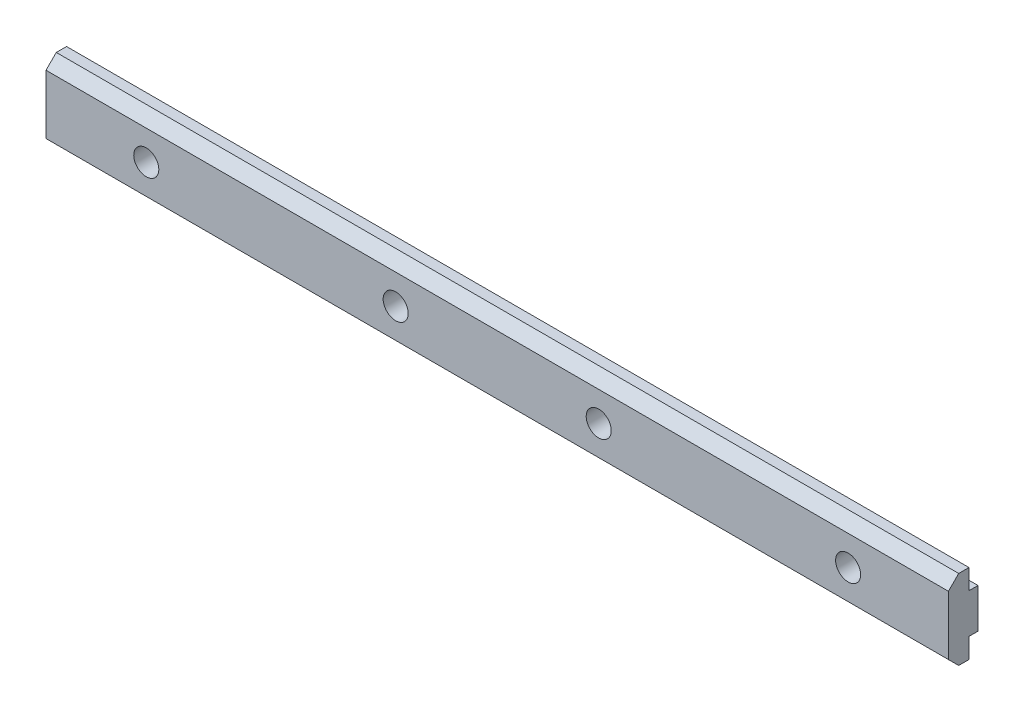
ISO-10303-21;
HEADER;
FILE_DESCRIPTION(('STEP AP214'),'2;1');
FILE_NAME('part.step','',(''),(''),'','','');
FILE_SCHEMA(('AUTOMOTIVE_DESIGN { 1 0 10303 214 1 1 1 1 }'));
ENDSEC;
DATA;
#1=APPLICATION_CONTEXT('core data for automotive mechanical design processes');
#2=APPLICATION_PROTOCOL_DEFINITION('international standard','automotive_design',2000,#1);
#3=PRODUCT_CONTEXT('',#1,'mechanical');
#4=PRODUCT('Part','Part','',(#3));
#5=PRODUCT_RELATED_PRODUCT_CATEGORY('part','',(#4));
#6=PRODUCT_DEFINITION_FORMATION('','',#4);
#7=PRODUCT_DEFINITION_CONTEXT('part definition',#1,'design');
#8=PRODUCT_DEFINITION('design','',#6,#7);
#9=PRODUCT_DEFINITION_SHAPE('','',#8);
#10=(LENGTH_UNIT() NAMED_UNIT(*) SI_UNIT(.MILLI.,.METRE.));
#11=(NAMED_UNIT(*) PLANE_ANGLE_UNIT() SI_UNIT($,.RADIAN.));
#12=(NAMED_UNIT(*) SI_UNIT($,.STERADIAN.) SOLID_ANGLE_UNIT());
#13=UNCERTAINTY_MEASURE_WITH_UNIT(LENGTH_MEASURE(1.E-05),#10,'distance_accuracy_value','');
#14=(GEOMETRIC_REPRESENTATION_CONTEXT(3) GLOBAL_UNCERTAINTY_ASSIGNED_CONTEXT((#13)) GLOBAL_UNIT_ASSIGNED_CONTEXT((#10,
#11,#12)) REPRESENTATION_CONTEXT('',''));
#15=CARTESIAN_POINT('',(0.,0.,0.));
#16=DIRECTION('',(0.,0.,1.));
#17=DIRECTION('',(1.,0.,0.));
#18=AXIS2_PLACEMENT_3D('',#15,#16,#17);
#19=CARTESIAN_POINT('',(90.,15.9000000000001,2.04999999999995));
#20=DIRECTION('',(0.,-0.707106781186567,-0.707106781186528));
#21=DIRECTION('',(0.,0.707106781186528,-0.707106781186567));
#22=AXIS2_PLACEMENT_3D('',#19,#20,#21);
#23=PLANE('',#22);
#24=DIRECTION('',(0.,-0.707106781186528,0.707106781186567));
#25=VECTOR('',#24,1.);
#26=CARTESIAN_POINT('',(-90.,15.9000000000001,2.04999999999995));
#27=LINE('',#26,#25);
#28=CARTESIAN_POINT('',(-90.,15.9000000000001,2.04999999999995));
#29=VERTEX_POINT('',#28);
#30=CARTESIAN_POINT('',(-90.,13.85,4.10000000000014));
#31=VERTEX_POINT('',#30);
#32=EDGE_CURVE('E146',#29,#31,#27,.T.);
#33=ORIENTED_EDGE('',*,*,#32,.T.);
#34=DIRECTION('',(-1.,0.,0.));
#35=VECTOR('',#34,1.);
#36=CARTESIAN_POINT('',(90.,13.85,4.10000000000014));
#37=LINE('',#36,#35);
#38=CARTESIAN_POINT('',(90.,13.85,4.10000000000014));
#39=VERTEX_POINT('',#38);
#40=EDGE_CURVE('E11',#39,#31,#37,.T.);
#41=ORIENTED_EDGE('',*,*,#40,.F.);
#42=DIRECTION('',(0.,-0.707106781186528,0.707106781186567));
#43=VECTOR('',#42,1.);
#44=CARTESIAN_POINT('',(90.,15.9000000000001,2.04999999999995));
#45=LINE('',#44,#43);
#46=CARTESIAN_POINT('',(90.,15.9000000000001,2.04999999999995));
#47=VERTEX_POINT('',#46);
#48=EDGE_CURVE('E165',#47,#39,#45,.T.);
#49=ORIENTED_EDGE('',*,*,#48,.F.);
#50=DIRECTION('',(-1.,0.,0.));
#51=VECTOR('',#50,1.);
#52=CARTESIAN_POINT('',(90.,15.9000000000001,2.04999999999995));
#53=LINE('',#52,#51);
#54=EDGE_CURVE('E142',#47,#29,#53,.T.);
#55=ORIENTED_EDGE('',*,*,#54,.T.);
#56=EDGE_LOOP('',(#33,#41,#49,#55));
#57=FACE_BOUND('',#56,.T.);
#58=ADVANCED_FACE('F38',(#57),#23,.F.);
#59=CARTESIAN_POINT('',(90.,13.85,4.10000000000014));
#60=DIRECTION('',(0.,0.,-1.));
#61=DIRECTION('',(-1.,0.,0.));
#62=AXIS2_PLACEMENT_3D('',#59,#60,#61);
#63=PLANE('',#62);
#64=CARTESIAN_POINT('',(70.,7.95000000000005,4.10000000000014));
#65=DIRECTION('',(0.,0.,-1.));
#66=DIRECTION('',(-1.,0.,0.));
#67=AXIS2_PLACEMENT_3D('',#64,#65,#66);
#68=CIRCLE('',#67,2.5);
#69=CARTESIAN_POINT('',(67.5,7.95000000000005,4.10000000000014));
#70=VERTEX_POINT('',#69);
#71=EDGE_CURVE('E229',#70,#70,#68,.T.);
#72=ORIENTED_EDGE('',*,*,#71,.T.);
#73=EDGE_LOOP('',(#72));
#74=FACE_BOUND('',#73,.T.);
#75=CARTESIAN_POINT('',(20.25,7.95000000000005,4.10000000000014));
#76=DIRECTION('',(0.,0.,-1.));
#77=DIRECTION('',(-1.,0.,0.));
#78=AXIS2_PLACEMENT_3D('',#75,#76,#77);
#79=CIRCLE('',#78,2.5);
#80=CARTESIAN_POINT('',(17.75,7.95000000000005,4.10000000000014));
#81=VERTEX_POINT('',#80);
#82=EDGE_CURVE('E223',#81,#81,#79,.T.);
#83=ORIENTED_EDGE('',*,*,#82,.T.);
#84=EDGE_LOOP('',(#83));
#85=FACE_BOUND('',#84,.T.);
#86=CARTESIAN_POINT('',(-20.25,7.95000000000009,4.10000000000014));
#87=DIRECTION('',(0.,0.,-1.));
#88=DIRECTION('',(-1.,0.,0.));
#89=AXIS2_PLACEMENT_3D('',#86,#87,#88);
#90=CIRCLE('',#89,2.5);
#91=CARTESIAN_POINT('',(-22.75,7.95000000000009,4.10000000000014));
#92=VERTEX_POINT('',#91);
#93=EDGE_CURVE('E217',#92,#92,#90,.T.);
#94=ORIENTED_EDGE('',*,*,#93,.T.);
#95=EDGE_LOOP('',(#94));
#96=FACE_BOUND('',#95,.T.);
#97=CARTESIAN_POINT('',(-70.,7.95000000000019,4.10000000000014));
#98=DIRECTION('',(0.,0.,-1.));
#99=DIRECTION('',(-1.,0.,0.));
#100=AXIS2_PLACEMENT_3D('',#97,#98,#99);
#101=CIRCLE('',#100,2.5);
#102=CARTESIAN_POINT('',(-72.5,7.95000000000019,4.10000000000014));
#103=VERTEX_POINT('',#102);
#104=EDGE_CURVE('E150',#103,#103,#101,.T.);
#105=ORIENTED_EDGE('',*,*,#104,.T.);
#106=EDGE_LOOP('',(#105));
#107=FACE_BOUND('',#106,.T.);
#108=DIRECTION('',(0.,-1.,0.));
#109=VECTOR('',#108,1.);
#110=CARTESIAN_POINT('',(-90.,13.85,4.10000000000014));
#111=LINE('',#110,#109);
#112=CARTESIAN_POINT('',(-90.,2.05000000000007,4.10000000000014));
#113=VERTEX_POINT('',#112);
#114=EDGE_CURVE('E149',#31,#113,#111,.T.);
#115=ORIENTED_EDGE('',*,*,#114,.T.);
#116=DIRECTION('',(-1.,0.,0.));
#117=VECTOR('',#116,1.);
#118=CARTESIAN_POINT('',(90.,2.05000000000007,4.10000000000014));
#119=LINE('',#118,#117);
#120=CARTESIAN_POINT('',(90.,2.05000000000007,4.10000000000014));
#121=VERTEX_POINT('',#120);
#122=EDGE_CURVE('E46',#121,#113,#119,.T.);
#123=ORIENTED_EDGE('',*,*,#122,.F.);
#124=DIRECTION('',(0.,-1.,0.));
#125=VECTOR('',#124,1.);
#126=CARTESIAN_POINT('',(90.,13.85,4.10000000000014));
#127=LINE('',#126,#125);
#128=EDGE_CURVE('E103',#39,#121,#127,.T.);
#129=ORIENTED_EDGE('',*,*,#128,.F.);
#130=ORIENTED_EDGE('',*,*,#40,.T.);
#131=EDGE_LOOP('',(#115,#123,#129,#130));
#132=FACE_BOUND('',#131,.T.);
#133=ADVANCED_FACE('F266',(#74,#85,#96,#107,#132),#63,.F.);
#134=CARTESIAN_POINT('',(90.,0.,2.04999999999995));
#135=DIRECTION('',(0.,0.707106781186567,-0.707106781186528));
#136=DIRECTION('',(0.,0.707106781186528,0.707106781186567));
#137=AXIS2_PLACEMENT_3D('',#134,#135,#136);
#138=PLANE('',#137);
#139=DIRECTION('',(0.,-0.707106781186528,-0.707106781186567));
#140=VECTOR('',#139,1.);
#141=CARTESIAN_POINT('',(-90.,0.,2.04999999999995));
#142=LINE('',#141,#140);
#143=CARTESIAN_POINT('',(-90.,0.,2.04999999999995));
#144=VERTEX_POINT('',#143);
#145=EDGE_CURVE('E152',#113,#144,#142,.T.);
#146=ORIENTED_EDGE('',*,*,#145,.T.);
#147=DIRECTION('',(-1.,0.,0.));
#148=VECTOR('',#147,1.);
#149=CARTESIAN_POINT('',(90.,0.,2.04999999999995));
#150=LINE('',#149,#148);
#151=CARTESIAN_POINT('',(90.,0.,2.04999999999995));
#152=VERTEX_POINT('',#151);
#153=EDGE_CURVE('E178',#152,#144,#150,.T.);
#154=ORIENTED_EDGE('',*,*,#153,.F.);
#155=DIRECTION('',(0.,-0.707106781186528,-0.707106781186567));
#156=VECTOR('',#155,1.);
#157=CARTESIAN_POINT('',(90.,0.,2.04999999999995));
#158=LINE('',#157,#156);
#159=EDGE_CURVE('E186',#121,#152,#158,.T.);
#160=ORIENTED_EDGE('',*,*,#159,.F.);
#161=ORIENTED_EDGE('',*,*,#122,.T.);
#162=EDGE_LOOP('',(#146,#154,#160,#161));
#163=FACE_BOUND('',#162,.T.);
#164=ADVANCED_FACE('F184',(#163),#138,.F.);
#165=CARTESIAN_POINT('',(90.,0.,0.));
#166=DIRECTION('',(0.,1.,0.));
#167=DIRECTION('',(0.,0.,1.));
#168=AXIS2_PLACEMENT_3D('',#165,#166,#167);
#169=PLANE('',#168);
#170=DIRECTION('',(0.,0.,-1.));
#171=VECTOR('',#170,1.);
#172=CARTESIAN_POINT('',(-90.,0.,0.));
#173=LINE('',#172,#171);
#174=CARTESIAN_POINT('',(-90.,0.,0.));
#175=VERTEX_POINT('',#174);
#176=EDGE_CURVE('E154',#144,#175,#173,.T.);
#177=ORIENTED_EDGE('',*,*,#176,.T.);
#178=DIRECTION('',(-1.,0.,0.));
#179=VECTOR('',#178,1.);
#180=CARTESIAN_POINT('',(90.,0.,0.));
#181=LINE('',#180,#179);
#182=CARTESIAN_POINT('',(90.,0.,0.));
#183=VERTEX_POINT('',#182);
#184=EDGE_CURVE('E175',#183,#175,#181,.T.);
#185=ORIENTED_EDGE('',*,*,#184,.F.);
#186=DIRECTION('',(0.,0.,-1.));
#187=VECTOR('',#186,1.);
#188=CARTESIAN_POINT('',(90.,0.,0.));
#189=LINE('',#188,#187);
#190=EDGE_CURVE('E204',#152,#183,#189,.T.);
#191=ORIENTED_EDGE('',*,*,#190,.F.);
#192=ORIENTED_EDGE('',*,*,#153,.T.);
#193=EDGE_LOOP('',(#177,#185,#191,#192));
#194=FACE_BOUND('',#193,.T.);
#195=ADVANCED_FACE('F195',(#194),#169,.F.);
#196=CARTESIAN_POINT('',(90.,0.,0.));
#197=DIRECTION('',(0.,0.,1.));
#198=DIRECTION('',(1.,0.,0.));
#199=AXIS2_PLACEMENT_3D('',#196,#197,#198);
#200=PLANE('',#199);
#201=DIRECTION('',(0.,1.,0.));
#202=VECTOR('',#201,1.);
#203=CARTESIAN_POINT('',(-90.,0.,0.));
#204=LINE('',#203,#202);
#205=CARTESIAN_POINT('',(-90.,4.00000000000011,0.));
#206=VERTEX_POINT('',#205);
#207=EDGE_CURVE('E156',#175,#206,#204,.T.);
#208=ORIENTED_EDGE('',*,*,#207,.T.);
#209=DIRECTION('',(-1.,0.,0.));
#210=VECTOR('',#209,1.);
#211=CARTESIAN_POINT('',(90.,4.00000000000011,0.));
#212=LINE('',#211,#210);
#213=CARTESIAN_POINT('',(90.,4.00000000000011,0.));
#214=VERTEX_POINT('',#213);
#215=EDGE_CURVE('E172',#214,#206,#212,.T.);
#216=ORIENTED_EDGE('',*,*,#215,.F.);
#217=DIRECTION('',(0.,1.,0.));
#218=VECTOR('',#217,1.);
#219=CARTESIAN_POINT('',(90.,0.,0.));
#220=LINE('',#219,#218);
#221=EDGE_CURVE('E201',#183,#214,#220,.T.);
#222=ORIENTED_EDGE('',*,*,#221,.F.);
#223=ORIENTED_EDGE('',*,*,#184,.T.);
#224=EDGE_LOOP('',(#208,#216,#222,#223));
#225=FACE_BOUND('',#224,.T.);
#226=ADVANCED_FACE('F199',(#225),#200,.F.);
#227=CARTESIAN_POINT('',(90.,4.,-1.79999999999995));
#228=DIRECTION('',(0.,1.,0.));
#229=DIRECTION('',(0.,0.,1.));
#230=AXIS2_PLACEMENT_3D('',#227,#228,#229);
#231=PLANE('',#230);
#232=DIRECTION('',(0.,0.,-1.));
#233=VECTOR('',#232,1.);
#234=CARTESIAN_POINT('',(-90.,4.,-1.79999999999995));
#235=LINE('',#234,#233);
#236=CARTESIAN_POINT('',(-90.,4.,-1.79999999999995));
#237=VERTEX_POINT('',#236);
#238=EDGE_CURVE('E158',#206,#237,#235,.T.);
#239=ORIENTED_EDGE('',*,*,#238,.T.);
#240=DIRECTION('',(-1.,0.,0.));
#241=VECTOR('',#240,1.);
#242=CARTESIAN_POINT('',(90.,4.,-1.79999999999995));
#243=LINE('',#242,#241);
#244=CARTESIAN_POINT('',(90.,4.,-1.79999999999995));
#245=VERTEX_POINT('',#244);
#246=EDGE_CURVE('E169',#245,#237,#243,.T.);
#247=ORIENTED_EDGE('',*,*,#246,.F.);
#248=DIRECTION('',(0.,0.,-1.));
#249=VECTOR('',#248,1.);
#250=CARTESIAN_POINT('',(90.,4.,-1.79999999999995));
#251=LINE('',#250,#249);
#252=EDGE_CURVE('E203',#214,#245,#251,.T.);
#253=ORIENTED_EDGE('',*,*,#252,.F.);
#254=ORIENTED_EDGE('',*,*,#215,.T.);
#255=EDGE_LOOP('',(#239,#247,#253,#254));
#256=FACE_BOUND('',#255,.T.);
#257=ADVANCED_FACE('F242',(#256),#231,.F.);
#258=CARTESIAN_POINT('',(90.,4.,-1.79999999999995));
#259=DIRECTION('',(0.,0.,1.));
#260=DIRECTION('',(1.,0.,0.));
#261=AXIS2_PLACEMENT_3D('',#258,#259,#260);
#262=PLANE('',#261);
#263=CARTESIAN_POINT('',(70.,7.95000000000005,-1.79999999999995));
#264=DIRECTION('',(0.,0.,-1.));
#265=DIRECTION('',(-1.,0.,0.));
#266=AXIS2_PLACEMENT_3D('',#263,#264,#265);
#267=CIRCLE('',#266,2.5);
#268=CARTESIAN_POINT('',(67.5,7.95000000000005,-1.79999999999995));
#269=VERTEX_POINT('',#268);
#270=EDGE_CURVE('E232',#269,#269,#267,.T.);
#271=ORIENTED_EDGE('',*,*,#270,.F.);
#272=EDGE_LOOP('',(#271));
#273=FACE_BOUND('',#272,.T.);
#274=CARTESIAN_POINT('',(20.25,7.95000000000005,-1.79999999999995));
#275=DIRECTION('',(0.,0.,-1.));
#276=DIRECTION('',(-1.,0.,0.));
#277=AXIS2_PLACEMENT_3D('',#274,#275,#276);
#278=CIRCLE('',#277,2.5);
#279=CARTESIAN_POINT('',(17.75,7.95000000000005,-1.79999999999995));
#280=VERTEX_POINT('',#279);
#281=EDGE_CURVE('E226',#280,#280,#278,.T.);
#282=ORIENTED_EDGE('',*,*,#281,.F.);
#283=EDGE_LOOP('',(#282));
#284=FACE_BOUND('',#283,.T.);
#285=CARTESIAN_POINT('',(-20.25,7.95000000000009,-1.79999999999995));
#286=DIRECTION('',(0.,0.,-1.));
#287=DIRECTION('',(-1.,0.,0.));
#288=AXIS2_PLACEMENT_3D('',#285,#286,#287);
#289=CIRCLE('',#288,2.5);
#290=CARTESIAN_POINT('',(-22.75,7.95000000000009,-1.79999999999995));
#291=VERTEX_POINT('',#290);
#292=EDGE_CURVE('E220',#291,#291,#289,.T.);
#293=ORIENTED_EDGE('',*,*,#292,.F.);
#294=EDGE_LOOP('',(#293));
#295=FACE_BOUND('',#294,.T.);
#296=CARTESIAN_POINT('',(-70.,7.95000000000019,-1.79999999999995));
#297=DIRECTION('',(0.,0.,-1.));
#298=DIRECTION('',(-1.,0.,0.));
#299=AXIS2_PLACEMENT_3D('',#296,#297,#298);
#300=CIRCLE('',#299,2.5);
#301=CARTESIAN_POINT('',(-72.5,7.95000000000019,-1.79999999999995));
#302=VERTEX_POINT('',#301);
#303=EDGE_CURVE('E214',#302,#302,#300,.T.);
#304=ORIENTED_EDGE('',*,*,#303,.F.);
#305=EDGE_LOOP('',(#304));
#306=FACE_BOUND('',#305,.T.);
#307=DIRECTION('',(0.,1.,0.));
#308=VECTOR('',#307,1.);
#309=CARTESIAN_POINT('',(-90.,4.,-1.79999999999995));
#310=LINE('',#309,#308);
#311=CARTESIAN_POINT('',(-90.,11.9000000000001,-1.79999999999995));
#312=VERTEX_POINT('',#311);
#313=EDGE_CURVE('E160',#237,#312,#310,.T.);
#314=ORIENTED_EDGE('',*,*,#313,.T.);
#315=DIRECTION('',(-1.,0.,0.));
#316=VECTOR('',#315,1.);
#317=CARTESIAN_POINT('',(90.,11.9000000000001,-1.79999999999995));
#318=LINE('',#317,#316);
#319=CARTESIAN_POINT('',(90.,11.9000000000001,-1.79999999999995));
#320=VERTEX_POINT('',#319);
#321=EDGE_CURVE('E137',#320,#312,#318,.T.);
#322=ORIENTED_EDGE('',*,*,#321,.F.);
#323=DIRECTION('',(0.,1.,0.));
#324=VECTOR('',#323,1.);
#325=CARTESIAN_POINT('',(90.,4.,-1.79999999999995));
#326=LINE('',#325,#324);
#327=EDGE_CURVE('E128',#245,#320,#326,.T.);
#328=ORIENTED_EDGE('',*,*,#327,.F.);
#329=ORIENTED_EDGE('',*,*,#246,.T.);
#330=EDGE_LOOP('',(#314,#322,#328,#329));
#331=FACE_BOUND('',#330,.T.);
#332=ADVANCED_FACE('F239',(#273,#284,#295,#306,#331),#262,.F.);
#333=CARTESIAN_POINT('',(90.,11.9000000000001,-1.79999999999995));
#334=DIRECTION('',(0.,-1.,0.));
#335=DIRECTION('',(0.,0.,-1.));
#336=AXIS2_PLACEMENT_3D('',#333,#334,#335);
#337=PLANE('',#336);
#338=DIRECTION('',(0.,0.,1.));
#339=VECTOR('',#338,1.);
#340=CARTESIAN_POINT('',(-90.,11.9000000000001,-1.79999999999995));
#341=LINE('',#340,#339);
#342=CARTESIAN_POINT('',(-90.,11.9000000000002,0.));
#343=VERTEX_POINT('',#342);
#344=EDGE_CURVE('E136',#312,#343,#341,.T.);
#345=ORIENTED_EDGE('',*,*,#344,.T.);
#346=DIRECTION('',(-1.,0.,0.));
#347=VECTOR('',#346,1.);
#348=CARTESIAN_POINT('',(90.,11.9000000000002,0.));
#349=LINE('',#348,#347);
#350=CARTESIAN_POINT('',(90.,11.9000000000002,0.));
#351=VERTEX_POINT('',#350);
#352=EDGE_CURVE('E133',#351,#343,#349,.T.);
#353=ORIENTED_EDGE('',*,*,#352,.F.);
#354=DIRECTION('',(0.,0.,1.));
#355=VECTOR('',#354,1.);
#356=CARTESIAN_POINT('',(90.,11.9000000000001,-1.79999999999995));
#357=LINE('',#356,#355);
#358=EDGE_CURVE('E122',#320,#351,#357,.T.);
#359=ORIENTED_EDGE('',*,*,#358,.F.);
#360=ORIENTED_EDGE('',*,*,#321,.T.);
#361=EDGE_LOOP('',(#345,#353,#359,#360));
#362=FACE_BOUND('',#361,.T.);
#363=ADVANCED_FACE('F134',(#362),#337,.F.);
#364=CARTESIAN_POINT('',(90.,11.9000000000002,0.));
#365=DIRECTION('',(0.,0.,1.));
#366=DIRECTION('',(1.,0.,0.));
#367=AXIS2_PLACEMENT_3D('',#364,#365,#366);
#368=PLANE('',#367);
#369=DIRECTION('',(0.,1.,0.));
#370=VECTOR('',#369,1.);
#371=CARTESIAN_POINT('',(-90.,11.9000000000002,0.));
#372=LINE('',#371,#370);
#373=CARTESIAN_POINT('',(-90.,15.9000000000001,0.));
#374=VERTEX_POINT('',#373);
#375=EDGE_CURVE('E89',#343,#374,#372,.T.);
#376=ORIENTED_EDGE('',*,*,#375,.T.);
#377=DIRECTION('',(-1.,0.,0.));
#378=VECTOR('',#377,1.);
#379=CARTESIAN_POINT('',(90.,15.9000000000001,0.));
#380=LINE('',#379,#378);
#381=CARTESIAN_POINT('',(90.,15.9000000000001,0.));
#382=VERTEX_POINT('',#381);
#383=EDGE_CURVE('E138',#382,#374,#380,.T.);
#384=ORIENTED_EDGE('',*,*,#383,.F.);
#385=DIRECTION('',(0.,1.,0.));
#386=VECTOR('',#385,1.);
#387=CARTESIAN_POINT('',(90.,11.9000000000002,0.));
#388=LINE('',#387,#386);
#389=EDGE_CURVE('E126',#351,#382,#388,.T.);
#390=ORIENTED_EDGE('',*,*,#389,.F.);
#391=ORIENTED_EDGE('',*,*,#352,.T.);
#392=EDGE_LOOP('',(#376,#384,#390,#391));
#393=FACE_BOUND('',#392,.T.);
#394=ADVANCED_FACE('F140',(#393),#368,.F.);
#395=CARTESIAN_POINT('',(90.,15.9000000000001,0.));
#396=DIRECTION('',(0.,-1.,0.));
#397=DIRECTION('',(0.,0.,-1.));
#398=AXIS2_PLACEMENT_3D('',#395,#396,#397);
#399=PLANE('',#398);
#400=DIRECTION('',(0.,0.,1.));
#401=VECTOR('',#400,1.);
#402=CARTESIAN_POINT('',(-90.,15.9000000000001,0.));
#403=LINE('',#402,#401);
#404=EDGE_CURVE('E95',#374,#29,#403,.T.);
#405=ORIENTED_EDGE('',*,*,#404,.T.);
#406=ORIENTED_EDGE('',*,*,#54,.F.);
#407=DIRECTION('',(0.,0.,1.));
#408=VECTOR('',#407,1.);
#409=CARTESIAN_POINT('',(90.,15.9000000000001,0.));
#410=LINE('',#409,#408);
#411=EDGE_CURVE('E54',#382,#47,#410,.T.);
#412=ORIENTED_EDGE('',*,*,#411,.F.);
#413=ORIENTED_EDGE('',*,*,#383,.T.);
#414=EDGE_LOOP('',(#405,#406,#412,#413));
#415=FACE_BOUND('',#414,.T.);
#416=ADVANCED_FACE('F255',(#415),#399,.F.);
#417=CARTESIAN_POINT('',(90.,0.,0.));
#418=DIRECTION('',(-1.,0.,0.));
#419=DIRECTION('',(0.,0.,1.));
#420=AXIS2_PLACEMENT_3D('',#417,#418,#419);
#421=PLANE('',#420);
#422=ORIENTED_EDGE('',*,*,#48,.T.);
#423=ORIENTED_EDGE('',*,*,#128,.T.);
#424=ORIENTED_EDGE('',*,*,#159,.T.);
#425=ORIENTED_EDGE('',*,*,#190,.T.);
#426=ORIENTED_EDGE('',*,*,#221,.T.);
#427=ORIENTED_EDGE('',*,*,#252,.T.);
#428=ORIENTED_EDGE('',*,*,#327,.T.);
#429=ORIENTED_EDGE('',*,*,#358,.T.);
#430=ORIENTED_EDGE('',*,*,#389,.T.);
#431=ORIENTED_EDGE('',*,*,#411,.T.);
#432=EDGE_LOOP('',(#422,#423,#424,#425,#426,#427,#428,#429,#430,#431));
#433=FACE_BOUND('',#432,.T.);
#434=ADVANCED_FACE('F124',(#433),#421,.F.);
#435=CARTESIAN_POINT('',(-90.,0.,0.));
#436=DIRECTION('',(-1.,0.,0.));
#437=DIRECTION('',(0.,0.,1.));
#438=AXIS2_PLACEMENT_3D('',#435,#436,#437);
#439=PLANE('',#438);
#440=ORIENTED_EDGE('',*,*,#32,.F.);
#441=ORIENTED_EDGE('',*,*,#404,.F.);
#442=ORIENTED_EDGE('',*,*,#375,.F.);
#443=ORIENTED_EDGE('',*,*,#344,.F.);
#444=ORIENTED_EDGE('',*,*,#313,.F.);
#445=ORIENTED_EDGE('',*,*,#238,.F.);
#446=ORIENTED_EDGE('',*,*,#207,.F.);
#447=ORIENTED_EDGE('',*,*,#176,.F.);
#448=ORIENTED_EDGE('',*,*,#145,.F.);
#449=ORIENTED_EDGE('',*,*,#114,.F.);
#450=EDGE_LOOP('',(#440,#441,#442,#443,#444,#445,#446,#447,#448,#449));
#451=FACE_BOUND('',#450,.T.);
#452=ADVANCED_FACE('F190',(#451),#439,.T.);
#453=CARTESIAN_POINT('',(-70.,7.95000000000019,-1.79999999999995));
#454=DIRECTION('',(0.,0.,-1.));
#455=DIRECTION('',(-1.,0.,0.));
#456=AXIS2_PLACEMENT_3D('',#453,#454,#455);
#457=CYLINDRICAL_SURFACE('',#456,2.5);
#458=ORIENTED_EDGE('',*,*,#303,.T.);
#459=EDGE_LOOP('',(#458));
#460=FACE_BOUND('',#459,.T.);
#461=ORIENTED_EDGE('',*,*,#104,.F.);
#462=EDGE_LOOP('',(#461));
#463=FACE_BOUND('',#462,.T.);
#464=ADVANCED_FACE('F312',(#460,#463),#457,.F.);
#465=CARTESIAN_POINT('',(-20.25,7.95000000000009,-1.79999999999995));
#466=DIRECTION('',(0.,0.,-1.));
#467=DIRECTION('',(-1.,0.,0.));
#468=AXIS2_PLACEMENT_3D('',#465,#466,#467);
#469=CYLINDRICAL_SURFACE('',#468,2.5);
#470=ORIENTED_EDGE('',*,*,#292,.T.);
#471=EDGE_LOOP('',(#470));
#472=FACE_BOUND('',#471,.T.);
#473=ORIENTED_EDGE('',*,*,#93,.F.);
#474=EDGE_LOOP('',(#473));
#475=FACE_BOUND('',#474,.T.);
#476=ADVANCED_FACE('F333',(#472,#475),#469,.F.);
#477=CARTESIAN_POINT('',(20.25,7.95000000000005,-1.79999999999995));
#478=DIRECTION('',(0.,0.,-1.));
#479=DIRECTION('',(-1.,0.,0.));
#480=AXIS2_PLACEMENT_3D('',#477,#478,#479);
#481=CYLINDRICAL_SURFACE('',#480,2.5);
#482=ORIENTED_EDGE('',*,*,#281,.T.);
#483=EDGE_LOOP('',(#482));
#484=FACE_BOUND('',#483,.T.);
#485=ORIENTED_EDGE('',*,*,#82,.F.);
#486=EDGE_LOOP('',(#485));
#487=FACE_BOUND('',#486,.T.);
#488=ADVANCED_FACE('F344',(#484,#487),#481,.F.);
#489=CARTESIAN_POINT('',(70.,7.95000000000005,-1.79999999999995));
#490=DIRECTION('',(0.,0.,-1.));
#491=DIRECTION('',(-1.,0.,0.));
#492=AXIS2_PLACEMENT_3D('',#489,#490,#491);
#493=CYLINDRICAL_SURFACE('',#492,2.5);
#494=ORIENTED_EDGE('',*,*,#270,.T.);
#495=EDGE_LOOP('',(#494));
#496=FACE_BOUND('',#495,.T.);
#497=ORIENTED_EDGE('',*,*,#71,.F.);
#498=EDGE_LOOP('',(#497));
#499=FACE_BOUND('',#498,.T.);
#500=ADVANCED_FACE('F236',(#496,#499),#493,.F.);
#501=CLOSED_SHELL('',(#58,#133,#164,#195,#226,#257,#332,#363,#394,#416,#434,#452,#464,#476,#488,#500));
#502=MANIFOLD_SOLID_BREP('B2',#501);
#503=ADVANCED_BREP_SHAPE_REPRESENTATION('',(#18,#502),#14);
#504=SHAPE_DEFINITION_REPRESENTATION(#9,#503);
ENDSEC;
END-ISO-10303-21;
